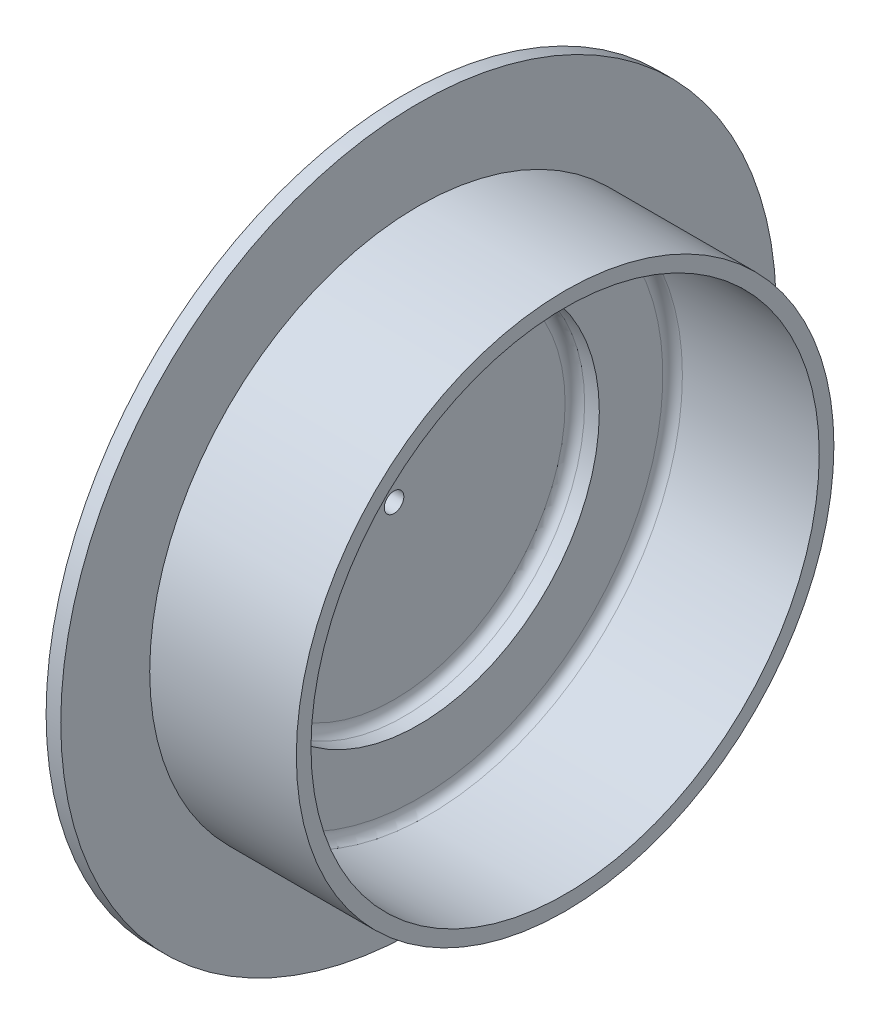
ISO-10303-21;
HEADER;
FILE_DESCRIPTION(('STEP AP214'),'2;1');
FILE_NAME('part.step','',(''),(''),'','','');
FILE_SCHEMA(('AUTOMOTIVE_DESIGN { 1 0 10303 214 1 1 1 1 }'));
ENDSEC;
DATA;
#1=APPLICATION_CONTEXT('core data for automotive mechanical design processes');
#2=APPLICATION_PROTOCOL_DEFINITION('international standard','automotive_design',2000,#1);
#3=PRODUCT_CONTEXT('',#1,'mechanical');
#4=PRODUCT('Part','Part','',(#3));
#5=PRODUCT_RELATED_PRODUCT_CATEGORY('part','',(#4));
#6=PRODUCT_DEFINITION_FORMATION('','',#4);
#7=PRODUCT_DEFINITION_CONTEXT('part definition',#1,'design');
#8=PRODUCT_DEFINITION('design','',#6,#7);
#9=PRODUCT_DEFINITION_SHAPE('','',#8);
#10=(LENGTH_UNIT() NAMED_UNIT(*) SI_UNIT(.MILLI.,.METRE.));
#11=(NAMED_UNIT(*) PLANE_ANGLE_UNIT() SI_UNIT($,.RADIAN.));
#12=(NAMED_UNIT(*) SI_UNIT($,.STERADIAN.) SOLID_ANGLE_UNIT());
#13=UNCERTAINTY_MEASURE_WITH_UNIT(LENGTH_MEASURE(1.E-05),#10,'distance_accuracy_value','');
#14=(GEOMETRIC_REPRESENTATION_CONTEXT(3) GLOBAL_UNCERTAINTY_ASSIGNED_CONTEXT((#13)) GLOBAL_UNIT_ASSIGNED_CONTEXT((#10,
#11,#12)) REPRESENTATION_CONTEXT('',''));
#15=CARTESIAN_POINT('',(0.,0.,0.));
#16=DIRECTION('',(0.,0.,1.));
#17=DIRECTION('',(1.,0.,0.));
#18=AXIS2_PLACEMENT_3D('',#15,#16,#17);
#19=CARTESIAN_POINT('',(0.,0.,0.));
#20=DIRECTION('',(-1.,0.,0.));
#21=DIRECTION('',(0.,0.,1.));
#22=AXIS2_PLACEMENT_3D('',#19,#20,#21);
#23=CYLINDRICAL_SURFACE('',#22,40.);
#24=CARTESIAN_POINT('',(0.,0.,0.));
#25=DIRECTION('',(-1.,0.,0.));
#26=DIRECTION('',(0.,0.,1.));
#27=AXIS2_PLACEMENT_3D('',#24,#25,#26);
#28=CIRCLE('',#27,40.);
#29=CARTESIAN_POINT('',(0.,0.,40.));
#30=VERTEX_POINT('',#29);
#31=EDGE_CURVE('E10',#30,#30,#28,.T.);
#32=ORIENTED_EDGE('',*,*,#31,.F.);
#33=EDGE_LOOP('',(#32));
#34=FACE_BOUND('',#33,.T.);
#35=CARTESIAN_POINT('',(15.,0.,0.));
#36=DIRECTION('',(-1.,0.,0.));
#37=DIRECTION('',(0.,0.,1.));
#38=AXIS2_PLACEMENT_3D('',#35,#36,#37);
#39=CIRCLE('',#38,40.);
#40=CARTESIAN_POINT('',(15.,0.,40.));
#41=VERTEX_POINT('',#40);
#42=EDGE_CURVE('E110',#41,#41,#39,.T.);
#43=ORIENTED_EDGE('',*,*,#42,.T.);
#44=EDGE_LOOP('',(#43));
#45=FACE_BOUND('',#44,.T.);
#46=ADVANCED_FACE('F39',(#34,#45),#23,.T.);
#47=CARTESIAN_POINT('',(0.,40.,0.));
#48=DIRECTION('',(1.,0.,0.));
#49=DIRECTION('',(0.,0.,-1.));
#50=AXIS2_PLACEMENT_3D('',#47,#48,#49);
#51=PLANE('',#50);
#52=CARTESIAN_POINT('',(0.,0.,0.));
#53=DIRECTION('',(-1.,0.,0.));
#54=DIRECTION('',(0.,0.,1.));
#55=AXIS2_PLACEMENT_3D('',#52,#53,#54);
#56=CIRCLE('',#55,37.);
#57=CARTESIAN_POINT('',(0.,0.,37.));
#58=VERTEX_POINT('',#57);
#59=EDGE_CURVE('E46',#58,#58,#56,.T.);
#60=ORIENTED_EDGE('',*,*,#59,.F.);
#61=EDGE_LOOP('',(#60));
#62=FACE_BOUND('',#61,.T.);
#63=ORIENTED_EDGE('',*,*,#31,.T.);
#64=EDGE_LOOP('',(#63));
#65=FACE_BOUND('',#64,.T.);
#66=ADVANCED_FACE('F202',(#62,#65),#51,.F.);
#67=CARTESIAN_POINT('',(0.,0.,0.));
#68=DIRECTION('',(-1.,0.,0.));
#69=DIRECTION('',(0.,0.,1.));
#70=AXIS2_PLACEMENT_3D('',#67,#68,#69);
#71=CYLINDRICAL_SURFACE('',#70,37.);
#72=CARTESIAN_POINT('',(8.,0.,0.));
#73=DIRECTION('',(-1.,0.,0.));
#74=DIRECTION('',(0.,0.,1.));
#75=AXIS2_PLACEMENT_3D('',#72,#73,#74);
#76=CIRCLE('',#75,37.);
#77=CARTESIAN_POINT('',(8.,0.,37.));
#78=VERTEX_POINT('',#77);
#79=EDGE_CURVE('E51',#78,#78,#76,.T.);
#80=ORIENTED_EDGE('',*,*,#79,.F.);
#81=EDGE_LOOP('',(#80));
#82=FACE_BOUND('',#81,.T.);
#83=ORIENTED_EDGE('',*,*,#59,.T.);
#84=EDGE_LOOP('',(#83));
#85=FACE_BOUND('',#84,.T.);
#86=ADVANCED_FACE('F197',(#82,#85),#71,.F.);
#87=CARTESIAN_POINT('',(8.,0.,0.));
#88=DIRECTION('',(-1.,0.,0.));
#89=DIRECTION('',(0.,0.,1.));
#90=AXIS2_PLACEMENT_3D('',#87,#88,#89);
#91=TOROIDAL_SURFACE('',#90,35.,2.);
#92=CARTESIAN_POINT('',(10.,0.,0.));
#93=DIRECTION('',(-1.,0.,0.));
#94=DIRECTION('',(0.,0.,1.));
#95=AXIS2_PLACEMENT_3D('',#92,#93,#94);
#96=CIRCLE('',#95,35.);
#97=CARTESIAN_POINT('',(10.,0.,35.));
#98=VERTEX_POINT('',#97);
#99=EDGE_CURVE('E56',#98,#98,#96,.T.);
#100=ORIENTED_EDGE('',*,*,#99,.F.);
#101=EDGE_LOOP('',(#100));
#102=FACE_BOUND('',#101,.T.);
#103=ORIENTED_EDGE('',*,*,#79,.T.);
#104=EDGE_LOOP('',(#103));
#105=FACE_BOUND('',#104,.T.);
#106=ADVANCED_FACE('F191',(#102,#105),#91,.F.);
#107=CARTESIAN_POINT('',(10.,35.,0.));
#108=DIRECTION('',(1.,0.,0.));
#109=DIRECTION('',(0.,0.,-1.));
#110=AXIS2_PLACEMENT_3D('',#107,#108,#109);
#111=PLANE('',#110);
#112=CARTESIAN_POINT('',(10.,0.,0.));
#113=DIRECTION('',(-1.,0.,0.));
#114=DIRECTION('',(0.,0.,1.));
#115=AXIS2_PLACEMENT_3D('',#112,#113,#114);
#116=CIRCLE('',#115,2.);
#117=CARTESIAN_POINT('',(10.,0.,2.));
#118=VERTEX_POINT('',#117);
#119=EDGE_CURVE('E62',#118,#118,#116,.T.);
#120=ORIENTED_EDGE('',*,*,#119,.F.);
#121=EDGE_LOOP('',(#120));
#122=FACE_BOUND('',#121,.T.);
#123=ORIENTED_EDGE('',*,*,#99,.T.);
#124=EDGE_LOOP('',(#123));
#125=FACE_BOUND('',#124,.T.);
#126=ADVANCED_FACE('F185',(#122,#125),#111,.F.);
#127=CARTESIAN_POINT('',(0.,0.,0.));
#128=DIRECTION('',(-1.,0.,0.));
#129=DIRECTION('',(0.,0.,1.));
#130=AXIS2_PLACEMENT_3D('',#127,#128,#129);
#131=CYLINDRICAL_SURFACE('',#130,2.);
#132=CARTESIAN_POINT('',(13.,0.,0.));
#133=DIRECTION('',(-1.,0.,0.));
#134=DIRECTION('',(0.,0.,1.));
#135=AXIS2_PLACEMENT_3D('',#132,#133,#134);
#136=CIRCLE('',#135,2.);
#137=CARTESIAN_POINT('',(13.,0.,2.));
#138=VERTEX_POINT('',#137);
#139=EDGE_CURVE('E66',#138,#138,#136,.T.);
#140=ORIENTED_EDGE('',*,*,#139,.F.);
#141=EDGE_LOOP('',(#140));
#142=FACE_BOUND('',#141,.T.);
#143=ORIENTED_EDGE('',*,*,#119,.T.);
#144=EDGE_LOOP('',(#143));
#145=FACE_BOUND('',#144,.T.);
#146=ADVANCED_FACE('F179',(#142,#145),#131,.F.);
#147=CARTESIAN_POINT('',(13.,2.,0.));
#148=DIRECTION('',(-1.,0.,0.));
#149=DIRECTION('',(0.,0.,1.));
#150=AXIS2_PLACEMENT_3D('',#147,#148,#149);
#151=PLANE('',#150);
#152=CARTESIAN_POINT('',(13.,0.,0.));
#153=DIRECTION('',(-1.,0.,0.));
#154=DIRECTION('',(0.,0.,1.));
#155=AXIS2_PLACEMENT_3D('',#152,#153,#154);
#156=CIRCLE('',#155,35.);
#157=CARTESIAN_POINT('',(13.,0.,35.));
#158=VERTEX_POINT('',#157);
#159=EDGE_CURVE('E70',#158,#158,#156,.T.);
#160=ORIENTED_EDGE('',*,*,#159,.F.);
#161=EDGE_LOOP('',(#160));
#162=FACE_BOUND('',#161,.T.);
#163=ORIENTED_EDGE('',*,*,#139,.T.);
#164=EDGE_LOOP('',(#163));
#165=FACE_BOUND('',#164,.T.);
#166=ADVANCED_FACE('F173',(#162,#165),#151,.F.);
#167=CARTESIAN_POINT('',(15.,0.,0.));
#168=DIRECTION('',(-1.,0.,0.));
#169=DIRECTION('',(0.,0.,1.));
#170=AXIS2_PLACEMENT_3D('',#167,#168,#169);
#171=TOROIDAL_SURFACE('',#170,35.,2.);
#172=CARTESIAN_POINT('',(15.,0.,0.));
#173=DIRECTION('',(-1.,0.,0.));
#174=DIRECTION('',(0.,0.,1.));
#175=AXIS2_PLACEMENT_3D('',#172,#173,#174);
#176=CIRCLE('',#175,37.);
#177=CARTESIAN_POINT('',(15.,0.,37.));
#178=VERTEX_POINT('',#177);
#179=EDGE_CURVE('E74',#178,#178,#176,.T.);
#180=ORIENTED_EDGE('',*,*,#179,.F.);
#181=EDGE_LOOP('',(#180));
#182=FACE_BOUND('',#181,.T.);
#183=ORIENTED_EDGE('',*,*,#159,.T.);
#184=EDGE_LOOP('',(#183));
#185=FACE_BOUND('',#184,.T.);
#186=ADVANCED_FACE('F167',(#182,#185),#171,.F.);
#187=CARTESIAN_POINT('',(0.,0.,0.));
#188=DIRECTION('',(-1.,0.,0.));
#189=DIRECTION('',(0.,0.,1.));
#190=AXIS2_PLACEMENT_3D('',#187,#188,#189);
#191=CYLINDRICAL_SURFACE('',#190,37.);
#192=CARTESIAN_POINT('',(18.,0.,0.));
#193=DIRECTION('',(-1.,0.,0.));
#194=DIRECTION('',(0.,0.,1.));
#195=AXIS2_PLACEMENT_3D('',#192,#193,#194);
#196=CIRCLE('',#195,37.);
#197=CARTESIAN_POINT('',(18.,0.,37.));
#198=VERTEX_POINT('',#197);
#199=EDGE_CURVE('E78',#198,#198,#196,.T.);
#200=ORIENTED_EDGE('',*,*,#199,.F.);
#201=EDGE_LOOP('',(#200));
#202=FACE_BOUND('',#201,.T.);
#203=ORIENTED_EDGE('',*,*,#179,.T.);
#204=EDGE_LOOP('',(#203));
#205=FACE_BOUND('',#204,.T.);
#206=ADVANCED_FACE('F161',(#202,#205),#191,.F.);
#207=CARTESIAN_POINT('',(18.,37.,0.));
#208=DIRECTION('',(-1.,0.,0.));
#209=DIRECTION('',(0.,0.,1.));
#210=AXIS2_PLACEMENT_3D('',#207,#208,#209);
#211=PLANE('',#210);
#212=CARTESIAN_POINT('',(18.,0.,0.));
#213=DIRECTION('',(-1.,0.,0.));
#214=DIRECTION('',(0.,0.,1.));
#215=AXIS2_PLACEMENT_3D('',#212,#213,#214);
#216=CIRCLE('',#215,50.);
#217=CARTESIAN_POINT('',(18.,0.,50.));
#218=VERTEX_POINT('',#217);
#219=EDGE_CURVE('E82',#218,#218,#216,.T.);
#220=ORIENTED_EDGE('',*,*,#219,.F.);
#221=EDGE_LOOP('',(#220));
#222=FACE_BOUND('',#221,.T.);
#223=ORIENTED_EDGE('',*,*,#199,.T.);
#224=EDGE_LOOP('',(#223));
#225=FACE_BOUND('',#224,.T.);
#226=ADVANCED_FACE('F155',(#222,#225),#211,.F.);
#227=CARTESIAN_POINT('',(20.,0.,0.));
#228=DIRECTION('',(-1.,0.,0.));
#229=DIRECTION('',(0.,0.,1.));
#230=AXIS2_PLACEMENT_3D('',#227,#228,#229);
#231=TOROIDAL_SURFACE('',#230,50.,2.);
#232=CARTESIAN_POINT('',(20.,0.,0.));
#233=DIRECTION('',(-1.,0.,0.));
#234=DIRECTION('',(0.,0.,1.));
#235=AXIS2_PLACEMENT_3D('',#232,#233,#234);
#236=CIRCLE('',#235,52.);
#237=CARTESIAN_POINT('',(20.,0.,52.));
#238=VERTEX_POINT('',#237);
#239=EDGE_CURVE('E86',#238,#238,#236,.T.);
#240=ORIENTED_EDGE('',*,*,#239,.F.);
#241=EDGE_LOOP('',(#240));
#242=FACE_BOUND('',#241,.T.);
#243=ORIENTED_EDGE('',*,*,#219,.T.);
#244=EDGE_LOOP('',(#243));
#245=FACE_BOUND('',#244,.T.);
#246=ADVANCED_FACE('F149',(#242,#245),#231,.F.);
#247=CARTESIAN_POINT('',(0.,0.,0.));
#248=DIRECTION('',(-1.,0.,0.));
#249=DIRECTION('',(0.,0.,1.));
#250=AXIS2_PLACEMENT_3D('',#247,#248,#249);
#251=CYLINDRICAL_SURFACE('',#250,52.);
#252=CARTESIAN_POINT('',(48.,0.,0.));
#253=DIRECTION('',(-1.,0.,0.));
#254=DIRECTION('',(0.,0.,1.));
#255=AXIS2_PLACEMENT_3D('',#252,#253,#254);
#256=CIRCLE('',#255,52.);
#257=CARTESIAN_POINT('',(48.,0.,52.));
#258=VERTEX_POINT('',#257);
#259=EDGE_CURVE('E90',#258,#258,#256,.T.);
#260=ORIENTED_EDGE('',*,*,#259,.F.);
#261=EDGE_LOOP('',(#260));
#262=FACE_BOUND('',#261,.T.);
#263=ORIENTED_EDGE('',*,*,#239,.T.);
#264=EDGE_LOOP('',(#263));
#265=FACE_BOUND('',#264,.T.);
#266=ADVANCED_FACE('F143',(#262,#265),#251,.F.);
#267=CARTESIAN_POINT('',(48.,52.,0.));
#268=DIRECTION('',(-1.,0.,0.));
#269=DIRECTION('',(0.,0.,1.));
#270=AXIS2_PLACEMENT_3D('',#267,#268,#269);
#271=PLANE('',#270);
#272=CARTESIAN_POINT('',(48.,0.,0.));
#273=DIRECTION('',(-1.,0.,0.));
#274=DIRECTION('',(0.,0.,1.));
#275=AXIS2_PLACEMENT_3D('',#272,#273,#274);
#276=CIRCLE('',#275,55.);
#277=CARTESIAN_POINT('',(48.,0.,55.));
#278=VERTEX_POINT('',#277);
#279=EDGE_CURVE('E94',#278,#278,#276,.T.);
#280=ORIENTED_EDGE('',*,*,#279,.F.);
#281=EDGE_LOOP('',(#280));
#282=FACE_BOUND('',#281,.T.);
#283=ORIENTED_EDGE('',*,*,#259,.T.);
#284=EDGE_LOOP('',(#283));
#285=FACE_BOUND('',#284,.T.);
#286=ADVANCED_FACE('F137',(#282,#285),#271,.F.);
#287=CARTESIAN_POINT('',(0.,0.,0.));
#288=DIRECTION('',(-1.,0.,0.));
#289=DIRECTION('',(0.,0.,1.));
#290=AXIS2_PLACEMENT_3D('',#287,#288,#289);
#291=CYLINDRICAL_SURFACE('',#290,55.);
#292=CARTESIAN_POINT('',(18.,0.,0.));
#293=DIRECTION('',(-1.,0.,0.));
#294=DIRECTION('',(0.,0.,1.));
#295=AXIS2_PLACEMENT_3D('',#292,#293,#294);
#296=CIRCLE('',#295,55.);
#297=CARTESIAN_POINT('',(18.,0.,55.));
#298=VERTEX_POINT('',#297);
#299=EDGE_CURVE('E98',#298,#298,#296,.T.);
#300=ORIENTED_EDGE('',*,*,#299,.F.);
#301=EDGE_LOOP('',(#300));
#302=FACE_BOUND('',#301,.T.);
#303=ORIENTED_EDGE('',*,*,#279,.T.);
#304=EDGE_LOOP('',(#303));
#305=FACE_BOUND('',#304,.T.);
#306=ADVANCED_FACE('F131',(#302,#305),#291,.T.);
#307=CARTESIAN_POINT('',(18.,55.,0.));
#308=DIRECTION('',(-1.,0.,0.));
#309=DIRECTION('',(0.,0.,1.));
#310=AXIS2_PLACEMENT_3D('',#307,#308,#309);
#311=PLANE('',#310);
#312=CARTESIAN_POINT('',(18.,0.,0.));
#313=DIRECTION('',(-1.,0.,0.));
#314=DIRECTION('',(0.,0.,1.));
#315=AXIS2_PLACEMENT_3D('',#312,#313,#314);
#316=CIRCLE('',#315,73.2);
#317=CARTESIAN_POINT('',(18.,0.,73.2));
#318=VERTEX_POINT('',#317);
#319=EDGE_CURVE('E102',#318,#318,#316,.T.);
#320=ORIENTED_EDGE('',*,*,#319,.F.);
#321=EDGE_LOOP('',(#320));
#322=FACE_BOUND('',#321,.T.);
#323=ORIENTED_EDGE('',*,*,#299,.T.);
#324=EDGE_LOOP('',(#323));
#325=FACE_BOUND('',#324,.T.);
#326=ADVANCED_FACE('F125',(#322,#325),#311,.F.);
#327=CARTESIAN_POINT('',(0.,0.,0.));
#328=DIRECTION('',(-1.,0.,0.));
#329=DIRECTION('',(0.,0.,1.));
#330=AXIS2_PLACEMENT_3D('',#327,#328,#329);
#331=CYLINDRICAL_SURFACE('',#330,73.2);
#332=CARTESIAN_POINT('',(15.,0.,0.));
#333=DIRECTION('',(-1.,0.,0.));
#334=DIRECTION('',(0.,0.,1.));
#335=AXIS2_PLACEMENT_3D('',#332,#333,#334);
#336=CIRCLE('',#335,73.2);
#337=CARTESIAN_POINT('',(15.,0.,73.2));
#338=VERTEX_POINT('',#337);
#339=EDGE_CURVE('E106',#338,#338,#336,.T.);
#340=ORIENTED_EDGE('',*,*,#339,.F.);
#341=EDGE_LOOP('',(#340));
#342=FACE_BOUND('',#341,.T.);
#343=ORIENTED_EDGE('',*,*,#319,.T.);
#344=EDGE_LOOP('',(#343));
#345=FACE_BOUND('',#344,.T.);
#346=ADVANCED_FACE('F119',(#342,#345),#331,.T.);
#347=CARTESIAN_POINT('',(15.,52.,0.));
#348=DIRECTION('',(1.,0.,0.));
#349=DIRECTION('',(0.,0.,-1.));
#350=AXIS2_PLACEMENT_3D('',#347,#348,#349);
#351=PLANE('',#350);
#352=ORIENTED_EDGE('',*,*,#42,.F.);
#353=EDGE_LOOP('',(#352));
#354=FACE_BOUND('',#353,.T.);
#355=ORIENTED_EDGE('',*,*,#339,.T.);
#356=EDGE_LOOP('',(#355));
#357=FACE_BOUND('',#356,.T.);
#358=ADVANCED_FACE('F116',(#354,#357),#351,.F.);
#359=CLOSED_SHELL('',(#46,#66,#86,#106,#126,#146,#166,#186,#206,#226,#246,#266,#286,#306,#326,
#346,#358));
#360=MANIFOLD_SOLID_BREP('B2',#359);
#361=ADVANCED_BREP_SHAPE_REPRESENTATION('',(#18,#360),#14);
#362=SHAPE_DEFINITION_REPRESENTATION(#9,#361);
ENDSEC;
END-ISO-10303-21;
